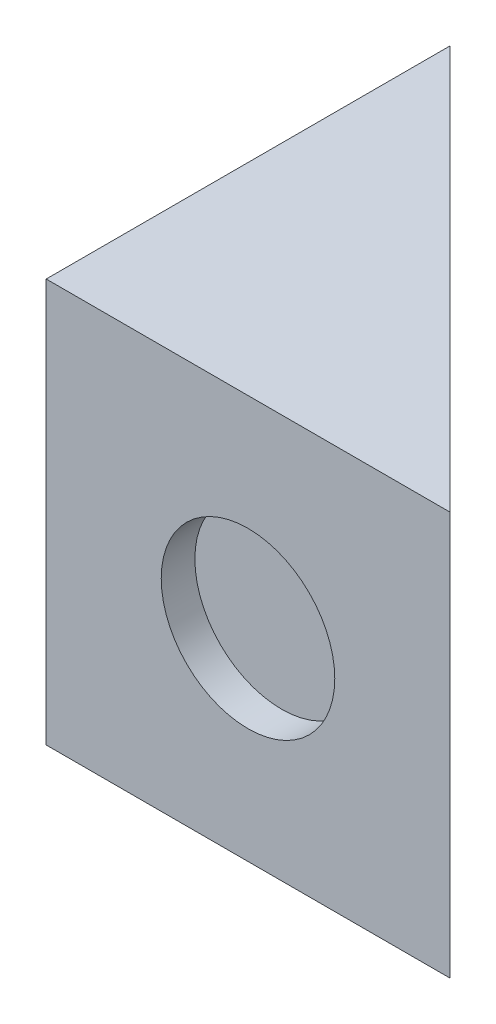
ISO-10303-21;
HEADER;
FILE_DESCRIPTION(('STEP AP214'),'2;1');
FILE_NAME('part.step','',(''),(''),'','','');
FILE_SCHEMA(('AUTOMOTIVE_DESIGN { 1 0 10303 214 1 1 1 1 }'));
ENDSEC;
DATA;
#1=APPLICATION_CONTEXT('core data for automotive mechanical design processes');
#2=APPLICATION_PROTOCOL_DEFINITION('international standard','automotive_design',2000,#1);
#3=PRODUCT_CONTEXT('',#1,'mechanical');
#4=PRODUCT('Part','Part','',(#3));
#5=PRODUCT_RELATED_PRODUCT_CATEGORY('part','',(#4));
#6=PRODUCT_DEFINITION_FORMATION('','',#4);
#7=PRODUCT_DEFINITION_CONTEXT('part definition',#1,'design');
#8=PRODUCT_DEFINITION('design','',#6,#7);
#9=PRODUCT_DEFINITION_SHAPE('','',#8);
#10=(LENGTH_UNIT() NAMED_UNIT(*) SI_UNIT(.MILLI.,.METRE.));
#11=(NAMED_UNIT(*) PLANE_ANGLE_UNIT() SI_UNIT($,.RADIAN.));
#12=(NAMED_UNIT(*) SI_UNIT($,.STERADIAN.) SOLID_ANGLE_UNIT());
#13=UNCERTAINTY_MEASURE_WITH_UNIT(LENGTH_MEASURE(1.E-05),#10,'distance_accuracy_value','');
#14=(GEOMETRIC_REPRESENTATION_CONTEXT(3) GLOBAL_UNCERTAINTY_ASSIGNED_CONTEXT((#13)) GLOBAL_UNIT_ASSIGNED_CONTEXT((#10,
#11,#12)) REPRESENTATION_CONTEXT('',''));
#15=CARTESIAN_POINT('',(0.,0.,0.));
#16=DIRECTION('',(0.,0.,1.));
#17=DIRECTION('',(1.,0.,0.));
#18=AXIS2_PLACEMENT_3D('',#15,#16,#17);
#19=CARTESIAN_POINT('',(38.1,38.1,0.));
#20=DIRECTION('',(0.,0.,-1.));
#21=DIRECTION('',(-1.,0.,0.));
#22=AXIS2_PLACEMENT_3D('',#19,#20,#21);
#23=PLANE('',#22);
#24=CARTESIAN_POINT('',(19.05,19.05,0.));
#25=DIRECTION('',(0.,0.,1.));
#26=DIRECTION('',(1.,0.,0.));
#27=AXIS2_PLACEMENT_3D('',#24,#25,#26);
#28=CIRCLE('',#27,8.1915);
#29=CARTESIAN_POINT('',(27.2415,19.05,0.));
#30=VERTEX_POINT('',#29);
#31=EDGE_CURVE('E87',#30,#30,#28,.T.);
#32=ORIENTED_EDGE('',*,*,#31,.F.);
#33=EDGE_LOOP('',(#32));
#34=FACE_BOUND('',#33,.T.);
#35=DIRECTION('',(1.,0.,0.));
#36=VECTOR('',#35,1.);
#37=CARTESIAN_POINT('',(38.1,0.,0.));
#38=LINE('',#37,#36);
#39=CARTESIAN_POINT('',(0.,0.,0.));
#40=VERTEX_POINT('',#39);
#41=CARTESIAN_POINT('',(38.1,0.,0.));
#42=VERTEX_POINT('',#41);
#43=EDGE_CURVE('E80',#40,#42,#38,.T.);
#44=ORIENTED_EDGE('',*,*,#43,.T.);
#45=DIRECTION('',(0.,-1.,0.));
#46=VECTOR('',#45,1.);
#47=CARTESIAN_POINT('',(38.1,38.1,0.));
#48=LINE('',#47,#46);
#49=CARTESIAN_POINT('',(38.1,38.1,0.));
#50=VERTEX_POINT('',#49);
#51=EDGE_CURVE('E11',#50,#42,#48,.T.);
#52=ORIENTED_EDGE('',*,*,#51,.F.);
#53=DIRECTION('',(1.,0.,0.));
#54=VECTOR('',#53,1.);
#55=CARTESIAN_POINT('',(38.1,38.1,0.));
#56=LINE('',#55,#54);
#57=CARTESIAN_POINT('',(0.,38.1,0.));
#58=VERTEX_POINT('',#57);
#59=EDGE_CURVE('E73',#58,#50,#56,.T.);
#60=ORIENTED_EDGE('',*,*,#59,.F.);
#61=DIRECTION('',(0.,-1.,0.));
#62=VECTOR('',#61,1.);
#63=CARTESIAN_POINT('',(0.,38.1,0.));
#64=LINE('',#63,#62);
#65=EDGE_CURVE('E81',#58,#40,#64,.T.);
#66=ORIENTED_EDGE('',*,*,#65,.T.);
#67=EDGE_LOOP('',(#44,#52,#60,#66));
#68=FACE_BOUND('',#67,.T.);
#69=ADVANCED_FACE('F33',(#34,#68),#23,.F.);
#70=CARTESIAN_POINT('',(0.,38.1,-38.1000000000004));
#71=DIRECTION('',(-0.707106781186551,0.,0.707106781186544));
#72=DIRECTION('',(0.707106781186544,0.,0.707106781186551));
#73=AXIS2_PLACEMENT_3D('',#70,#71,#72);
#74=PLANE('',#73);
#75=DIRECTION('',(-0.707106781186544,0.,-0.707106781186551));
#76=VECTOR('',#75,1.);
#77=CARTESIAN_POINT('',(0.,0.,-38.1000000000004));
#78=LINE('',#77,#76);
#79=CARTESIAN_POINT('',(0.,0.,-38.1000000000004));
#80=VERTEX_POINT('',#79);
#81=EDGE_CURVE('E61',#42,#80,#78,.T.);
#82=ORIENTED_EDGE('',*,*,#81,.T.);
#83=DIRECTION('',(0.,-1.,0.));
#84=VECTOR('',#83,1.);
#85=CARTESIAN_POINT('',(0.,38.1,-38.1000000000004));
#86=LINE('',#85,#84);
#87=CARTESIAN_POINT('',(0.,38.1,-38.1000000000004));
#88=VERTEX_POINT('',#87);
#89=EDGE_CURVE('E41',#88,#80,#86,.T.);
#90=ORIENTED_EDGE('',*,*,#89,.F.);
#91=DIRECTION('',(-0.707106781186544,0.,-0.707106781186551));
#92=VECTOR('',#91,1.);
#93=CARTESIAN_POINT('',(0.,38.1,-38.1000000000004));
#94=LINE('',#93,#92);
#95=EDGE_CURVE('E69',#50,#88,#94,.T.);
#96=ORIENTED_EDGE('',*,*,#95,.F.);
#97=ORIENTED_EDGE('',*,*,#51,.T.);
#98=EDGE_LOOP('',(#82,#90,#96,#97));
#99=FACE_BOUND('',#98,.T.);
#100=ADVANCED_FACE('F70',(#99),#74,.F.);
#101=CARTESIAN_POINT('',(0.,38.1,0.));
#102=DIRECTION('',(1.,0.,0.));
#103=DIRECTION('',(0.,0.,-1.));
#104=AXIS2_PLACEMENT_3D('',#101,#102,#103);
#105=PLANE('',#104);
#106=CARTESIAN_POINT('',(0.,19.05,-7.62));
#107=DIRECTION('',(-1.,0.,0.));
#108=DIRECTION('',(0.,0.,1.));
#109=AXIS2_PLACEMENT_3D('',#106,#107,#108);
#110=CIRCLE('',#109,4.8895);
#111=CARTESIAN_POINT('',(0.,19.05,-2.7305));
#112=VERTEX_POINT('',#111);
#113=EDGE_CURVE('E123',#112,#112,#110,.T.);
#114=ORIENTED_EDGE('',*,*,#113,.F.);
#115=EDGE_LOOP('',(#114));
#116=FACE_BOUND('',#115,.T.);
#117=CARTESIAN_POINT('',(0.,19.05,-25.4000000000004));
#118=DIRECTION('',(-1.,0.,0.));
#119=DIRECTION('',(0.,0.,1.));
#120=AXIS2_PLACEMENT_3D('',#117,#118,#119);
#121=CIRCLE('',#120,8.1915);
#122=CARTESIAN_POINT('',(0.,19.05,-17.2085000000004));
#123=VERTEX_POINT('',#122);
#124=EDGE_CURVE('E117',#123,#123,#121,.T.);
#125=ORIENTED_EDGE('',*,*,#124,.F.);
#126=EDGE_LOOP('',(#125));
#127=FACE_BOUND('',#126,.T.);
#128=DIRECTION('',(0.,0.,1.));
#129=VECTOR('',#128,1.);
#130=CARTESIAN_POINT('',(0.,0.,0.));
#131=LINE('',#130,#129);
#132=EDGE_CURVE('E66',#80,#40,#131,.T.);
#133=ORIENTED_EDGE('',*,*,#132,.T.);
#134=ORIENTED_EDGE('',*,*,#65,.F.);
#135=DIRECTION('',(0.,0.,1.));
#136=VECTOR('',#135,1.);
#137=CARTESIAN_POINT('',(0.,38.1,0.));
#138=LINE('',#137,#136);
#139=EDGE_CURVE('E49',#88,#58,#138,.T.);
#140=ORIENTED_EDGE('',*,*,#139,.F.);
#141=ORIENTED_EDGE('',*,*,#89,.T.);
#142=EDGE_LOOP('',(#133,#134,#140,#141));
#143=FACE_BOUND('',#142,.T.);
#144=ADVANCED_FACE('F92',(#116,#127,#143),#105,.F.);
#145=CARTESIAN_POINT('',(0.,38.1,0.));
#146=DIRECTION('',(0.,-1.,0.));
#147=DIRECTION('',(0.,0.,-1.));
#148=AXIS2_PLACEMENT_3D('',#145,#146,#147);
#149=PLANE('',#148);
#150=ORIENTED_EDGE('',*,*,#59,.T.);
#151=ORIENTED_EDGE('',*,*,#95,.T.);
#152=ORIENTED_EDGE('',*,*,#139,.T.);
#153=EDGE_LOOP('',(#150,#151,#152));
#154=FACE_BOUND('',#153,.T.);
#155=ADVANCED_FACE('F76',(#154),#149,.F.);
#156=CARTESIAN_POINT('',(0.,0.,0.));
#157=DIRECTION('',(0.,-1.,0.));
#158=DIRECTION('',(0.,0.,-1.));
#159=AXIS2_PLACEMENT_3D('',#156,#157,#158);
#160=PLANE('',#159);
#161=ORIENTED_EDGE('',*,*,#43,.F.);
#162=ORIENTED_EDGE('',*,*,#132,.F.);
#163=ORIENTED_EDGE('',*,*,#81,.F.);
#164=EDGE_LOOP('',(#161,#162,#163));
#165=FACE_BOUND('',#164,.T.);
#166=ADVANCED_FACE('F93',(#165),#160,.T.);
#167=CARTESIAN_POINT('',(19.05,19.05,-3.175));
#168=DIRECTION('',(0.,0.,1.));
#169=DIRECTION('',(1.,0.,0.));
#170=AXIS2_PLACEMENT_3D('',#167,#168,#169);
#171=CYLINDRICAL_SURFACE('',#170,8.1915);
#172=CARTESIAN_POINT('',(19.05,19.05,-3.175));
#173=DIRECTION('',(0.,0.,1.));
#174=DIRECTION('',(1.,0.,0.));
#175=AXIS2_PLACEMENT_3D('',#172,#173,#174);
#176=CIRCLE('',#175,8.1915);
#177=CARTESIAN_POINT('',(27.2415,19.05,-3.175));
#178=VERTEX_POINT('',#177);
#179=EDGE_CURVE('E83',#178,#178,#176,.T.);
#180=ORIENTED_EDGE('',*,*,#179,.F.);
#181=EDGE_LOOP('',(#180));
#182=FACE_BOUND('',#181,.T.);
#183=ORIENTED_EDGE('',*,*,#31,.T.);
#184=EDGE_LOOP('',(#183));
#185=FACE_BOUND('',#184,.T.);
#186=ADVANCED_FACE('F95',(#182,#185),#171,.F.);
#187=CARTESIAN_POINT('',(19.05,19.05,-3.175));
#188=DIRECTION('',(0.,0.,1.));
#189=DIRECTION('',(1.,0.,0.));
#190=AXIS2_PLACEMENT_3D('',#187,#188,#189);
#191=PLANE('',#190);
#192=ORIENTED_EDGE('',*,*,#179,.T.);
#193=EDGE_LOOP('',(#192));
#194=FACE_BOUND('',#193,.T.);
#195=ADVANCED_FACE('F101',(#194),#191,.T.);
#196=CARTESIAN_POINT('',(3.175,19.05,-25.4000000000004));
#197=DIRECTION('',(-1.,0.,0.));
#198=DIRECTION('',(0.,0.,1.));
#199=AXIS2_PLACEMENT_3D('',#196,#197,#198);
#200=CYLINDRICAL_SURFACE('',#199,8.1915);
#201=CARTESIAN_POINT('',(3.175,19.05,-25.4000000000004));
#202=DIRECTION('',(-1.,0.,0.));
#203=DIRECTION('',(0.,0.,1.));
#204=AXIS2_PLACEMENT_3D('',#201,#202,#203);
#205=CIRCLE('',#204,8.1915);
#206=CARTESIAN_POINT('',(3.175,19.05,-17.2085000000004));
#207=VERTEX_POINT('',#206);
#208=EDGE_CURVE('E114',#207,#207,#205,.T.);
#209=ORIENTED_EDGE('',*,*,#208,.F.);
#210=EDGE_LOOP('',(#209));
#211=FACE_BOUND('',#210,.T.);
#212=ORIENTED_EDGE('',*,*,#124,.T.);
#213=EDGE_LOOP('',(#212));
#214=FACE_BOUND('',#213,.T.);
#215=ADVANCED_FACE('F142',(#211,#214),#200,.F.);
#216=CARTESIAN_POINT('',(3.175,19.05,-25.4000000000004));
#217=DIRECTION('',(-1.,0.,0.));
#218=DIRECTION('',(0.,0.,1.));
#219=AXIS2_PLACEMENT_3D('',#216,#217,#218);
#220=PLANE('',#219);
#221=ORIENTED_EDGE('',*,*,#208,.T.);
#222=EDGE_LOOP('',(#221));
#223=FACE_BOUND('',#222,.T.);
#224=ADVANCED_FACE('F134',(#223),#220,.T.);
#225=CARTESIAN_POINT('',(1.6129,19.05,-7.62));
#226=DIRECTION('',(-1.,0.,0.));
#227=DIRECTION('',(0.,0.,1.));
#228=AXIS2_PLACEMENT_3D('',#225,#226,#227);
#229=CYLINDRICAL_SURFACE('',#228,4.8895);
#230=CARTESIAN_POINT('',(1.6129,19.05,-7.62));
#231=DIRECTION('',(-1.,0.,0.));
#232=DIRECTION('',(0.,0.,1.));
#233=AXIS2_PLACEMENT_3D('',#230,#231,#232);
#234=CIRCLE('',#233,4.8895);
#235=CARTESIAN_POINT('',(1.6129,19.05,-2.7305));
#236=VERTEX_POINT('',#235);
#237=EDGE_CURVE('E121',#236,#236,#234,.T.);
#238=ORIENTED_EDGE('',*,*,#237,.F.);
#239=EDGE_LOOP('',(#238));
#240=FACE_BOUND('',#239,.T.);
#241=ORIENTED_EDGE('',*,*,#113,.T.);
#242=EDGE_LOOP('',(#241));
#243=FACE_BOUND('',#242,.T.);
#244=ADVANCED_FACE('F131',(#240,#243),#229,.F.);
#245=CARTESIAN_POINT('',(1.6129,19.05,-7.62));
#246=DIRECTION('',(-1.,0.,0.));
#247=DIRECTION('',(0.,0.,1.));
#248=AXIS2_PLACEMENT_3D('',#245,#246,#247);
#249=PLANE('',#248);
#250=ORIENTED_EDGE('',*,*,#237,.T.);
#251=EDGE_LOOP('',(#250));
#252=FACE_BOUND('',#251,.T.);
#253=ADVANCED_FACE('F129',(#252),#249,.T.);
#254=CLOSED_SHELL('',(#69,#100,#144,#155,#166,#186,#195,#215,#224,#244,#253));
#255=MANIFOLD_SOLID_BREP('B2',#254);
#256=ADVANCED_BREP_SHAPE_REPRESENTATION('',(#18,#255),#14);
#257=SHAPE_DEFINITION_REPRESENTATION(#9,#256);
ENDSEC;
END-ISO-10303-21;
